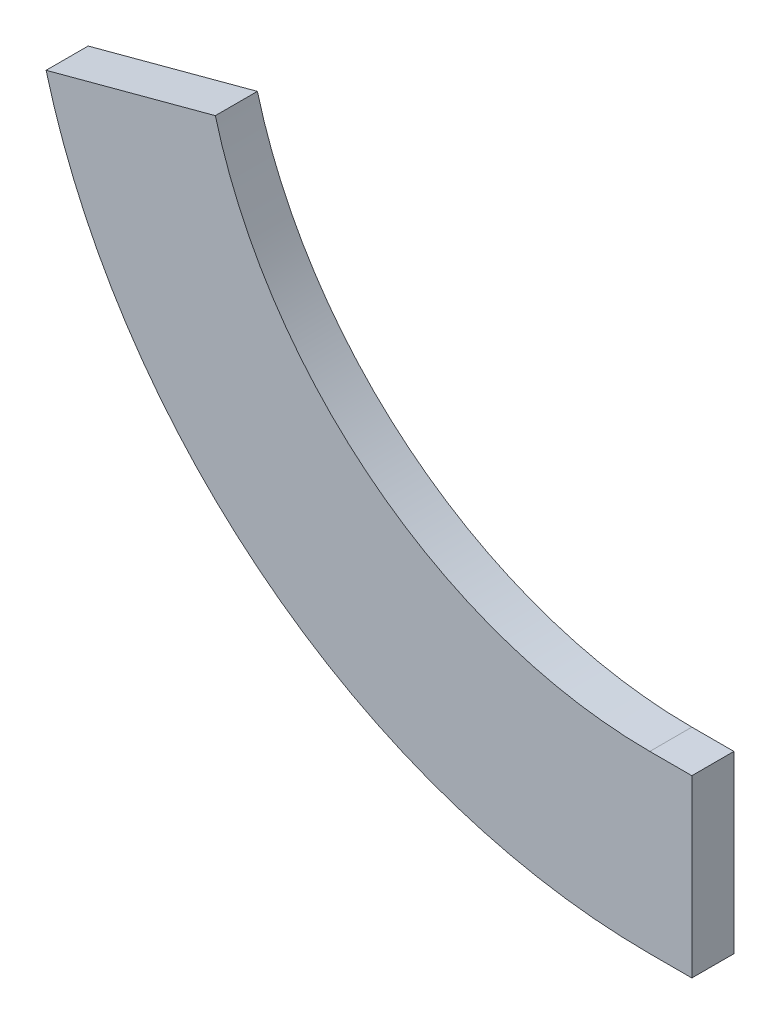
ISO-10303-21;
HEADER;
FILE_DESCRIPTION(('STEP AP214'),'2;1');
FILE_NAME('part.step','',(''),(''),'','','');
FILE_SCHEMA(('AUTOMOTIVE_DESIGN { 1 0 10303 214 1 1 1 1 }'));
ENDSEC;
DATA;
#1=APPLICATION_CONTEXT('core data for automotive mechanical design processes');
#2=APPLICATION_PROTOCOL_DEFINITION('international standard','automotive_design',2000,#1);
#3=PRODUCT_CONTEXT('',#1,'mechanical');
#4=PRODUCT('Part','Part','',(#3));
#5=PRODUCT_RELATED_PRODUCT_CATEGORY('part','',(#4));
#6=PRODUCT_DEFINITION_FORMATION('','',#4);
#7=PRODUCT_DEFINITION_CONTEXT('part definition',#1,'design');
#8=PRODUCT_DEFINITION('design','',#6,#7);
#9=PRODUCT_DEFINITION_SHAPE('','',#8);
#10=(LENGTH_UNIT() NAMED_UNIT(*) SI_UNIT(.MILLI.,.METRE.));
#11=(NAMED_UNIT(*) PLANE_ANGLE_UNIT() SI_UNIT($,.RADIAN.));
#12=(NAMED_UNIT(*) SI_UNIT($,.STERADIAN.) SOLID_ANGLE_UNIT());
#13=UNCERTAINTY_MEASURE_WITH_UNIT(LENGTH_MEASURE(1.E-05),#10,'distance_accuracy_value','');
#14=(GEOMETRIC_REPRESENTATION_CONTEXT(3) GLOBAL_UNCERTAINTY_ASSIGNED_CONTEXT((#13)) GLOBAL_UNIT_ASSIGNED_CONTEXT((#10,
#11,#12)) REPRESENTATION_CONTEXT('',''));
#15=CARTESIAN_POINT('',(0.,0.,0.));
#16=DIRECTION('',(0.,0.,1.));
#17=DIRECTION('',(1.,0.,0.));
#18=AXIS2_PLACEMENT_3D('',#15,#16,#17);
#19=CARTESIAN_POINT('',(-97.4016007566819,-31.75,1.524));
#20=DIRECTION('',(0.,-1.,0.));
#21=DIRECTION('',(1.,0.,0.));
#22=AXIS2_PLACEMENT_3D('',#19,#20,#21);
#23=PLANE('',#22);
#24=DIRECTION('',(-1.,0.,0.));
#25=VECTOR('',#24,1.);
#26=CARTESIAN_POINT('',(-97.4016007566819,-31.75,-1.524));
#27=LINE('',#26,#25);
#28=CARTESIAN_POINT('',(-97.4016007566819,-31.75,-1.524));
#29=VERTEX_POINT('',#28);
#30=CARTESIAN_POINT('',(-100.449600756682,-31.75,-1.524));
#31=VERTEX_POINT('',#30);
#32=EDGE_CURVE('E123',#29,#31,#27,.T.);
#33=ORIENTED_EDGE('',*,*,#32,.T.);
#34=DIRECTION('',(0.,0.,-1.));
#35=VECTOR('',#34,1.);
#36=CARTESIAN_POINT('',(-100.449600756682,-31.75,1.524));
#37=LINE('',#36,#35);
#38=CARTESIAN_POINT('',(-100.449600756682,-31.75,1.524));
#39=VERTEX_POINT('',#38);
#40=EDGE_CURVE('E11',#39,#31,#37,.T.);
#41=ORIENTED_EDGE('',*,*,#40,.F.);
#42=DIRECTION('',(-1.,0.,0.));
#43=VECTOR('',#42,1.);
#44=CARTESIAN_POINT('',(-97.4016007566819,-31.75,1.524));
#45=LINE('',#44,#43);
#46=CARTESIAN_POINT('',(-97.4016007566819,-31.75,1.524));
#47=VERTEX_POINT('',#46);
#48=EDGE_CURVE('E133',#47,#39,#45,.T.);
#49=ORIENTED_EDGE('',*,*,#48,.F.);
#50=DIRECTION('',(0.,0.,-1.));
#51=VECTOR('',#50,1.);
#52=CARTESIAN_POINT('',(-97.4016007566819,-31.75,1.524));
#53=LINE('',#52,#51);
#54=EDGE_CURVE('E119',#47,#29,#53,.T.);
#55=ORIENTED_EDGE('',*,*,#54,.T.);
#56=EDGE_LOOP('',(#33,#41,#49,#55));
#57=FACE_BOUND('',#56,.T.);
#58=ADVANCED_FACE('F39',(#57),#23,.F.);
#59=CARTESIAN_POINT('',(-100.449600756682,0.850738685968828,1.524));
#60=DIRECTION('',(0.,0.,-1.));
#61=DIRECTION('',(-1.,0.,0.));
#62=AXIS2_PLACEMENT_3D('',#59,#60,#61);
#63=CYLINDRICAL_SURFACE('',#62,32.6007386859688);
#64=CARTESIAN_POINT('',(-100.449600756682,0.850738685968828,-1.524));
#65=DIRECTION('',(0.,0.,-1.));
#66=DIRECTION('',(-1.,0.,0.));
#67=AXIS2_PLACEMENT_3D('',#64,#65,#66);
#68=CIRCLE('',#67,32.6007386859688);
#69=CARTESIAN_POINT('',(-131.93949620956,-7.58695337037059,-1.524));
#70=VERTEX_POINT('',#69);
#71=EDGE_CURVE('E126',#31,#70,#68,.T.);
#72=ORIENTED_EDGE('',*,*,#71,.T.);
#73=DIRECTION('',(0.,0.,-1.));
#74=VECTOR('',#73,1.);
#75=CARTESIAN_POINT('',(-131.93949620956,-7.58695337037059,1.524));
#76=LINE('',#75,#74);
#77=CARTESIAN_POINT('',(-131.93949620956,-7.58695337037059,1.524));
#78=VERTEX_POINT('',#77);
#79=EDGE_CURVE('E47',#78,#70,#76,.T.);
#80=ORIENTED_EDGE('',*,*,#79,.F.);
#81=CARTESIAN_POINT('',(-100.449600756682,0.850738685968828,1.524));
#82=DIRECTION('',(0.,0.,-1.));
#83=DIRECTION('',(-1.,0.,0.));
#84=AXIS2_PLACEMENT_3D('',#81,#82,#83);
#85=CIRCLE('',#84,32.6007386859688);
#86=EDGE_CURVE('E92',#39,#78,#85,.T.);
#87=ORIENTED_EDGE('',*,*,#86,.F.);
#88=ORIENTED_EDGE('',*,*,#40,.T.);
#89=EDGE_LOOP('',(#72,#80,#87,#88));
#90=FACE_BOUND('',#89,.T.);
#91=ADVANCED_FACE('F157',(#90),#63,.F.);
#92=CARTESIAN_POINT('',(-131.93949620956,-7.58695337037057,1.524));
#93=DIRECTION('',(0.258819045102524,-0.965925826289067,0.));
#94=DIRECTION('',(0.965925826289068,0.258819045102524,0.));
#95=AXIS2_PLACEMENT_3D('',#92,#93,#94);
#96=PLANE('',#95);
#97=DIRECTION('',(-0.965925826289067,-0.258819045102524,0.));
#98=VECTOR('',#97,1.);
#99=CARTESIAN_POINT('',(-131.93949620956,-7.58695337037057,-1.524));
#100=LINE('',#99,#98);
#101=CARTESIAN_POINT('',(-144.206754203431,-10.8739552431726,-1.524));
#102=VERTEX_POINT('',#101);
#103=EDGE_CURVE('E128',#70,#102,#100,.T.);
#104=ORIENTED_EDGE('',*,*,#103,.T.);
#105=DIRECTION('',(0.,0.,-1.));
#106=VECTOR('',#105,1.);
#107=CARTESIAN_POINT('',(-144.206754203431,-10.8739552431726,1.524));
#108=LINE('',#107,#106);
#109=CARTESIAN_POINT('',(-144.206754203431,-10.8739552431726,1.524));
#110=VERTEX_POINT('',#109);
#111=EDGE_CURVE('E114',#110,#102,#108,.T.);
#112=ORIENTED_EDGE('',*,*,#111,.F.);
#113=DIRECTION('',(-0.965925826289067,-0.258819045102524,0.));
#114=VECTOR('',#113,1.);
#115=CARTESIAN_POINT('',(-131.93949620956,-7.58695337037057,1.524));
#116=LINE('',#115,#114);
#117=EDGE_CURVE('E105',#78,#110,#116,.T.);
#118=ORIENTED_EDGE('',*,*,#117,.F.);
#119=ORIENTED_EDGE('',*,*,#79,.T.);
#120=EDGE_LOOP('',(#104,#112,#118,#119));
#121=FACE_BOUND('',#120,.T.);
#122=ADVANCED_FACE('F139',(#121),#96,.F.);
#123=CARTESIAN_POINT('',(-100.449600756682,0.850738685968806,1.524));
#124=DIRECTION('',(0.,0.,-1.));
#125=DIRECTION('',(-1.,0.,0.));
#126=AXIS2_PLACEMENT_3D('',#123,#124,#125);
#127=CYLINDRICAL_SURFACE('',#126,45.3007386859688);
#128=CARTESIAN_POINT('',(-100.449600756682,0.850738685968806,-1.524));
#129=DIRECTION('',(0.,0.,1.));
#130=DIRECTION('',(1.,0.,0.));
#131=AXIS2_PLACEMENT_3D('',#128,#129,#130);
#132=CIRCLE('',#131,45.3007386859688);
#133=CARTESIAN_POINT('',(-100.449600756682,-44.45,-1.524));
#134=VERTEX_POINT('',#133);
#135=EDGE_CURVE('E113',#102,#134,#132,.T.);
#136=ORIENTED_EDGE('',*,*,#135,.T.);
#137=DIRECTION('',(0.,0.,-1.));
#138=VECTOR('',#137,1.);
#139=CARTESIAN_POINT('',(-100.449600756682,-44.45,1.524));
#140=LINE('',#139,#138);
#141=CARTESIAN_POINT('',(-100.449600756682,-44.45,1.524));
#142=VERTEX_POINT('',#141);
#143=EDGE_CURVE('E110',#142,#134,#140,.T.);
#144=ORIENTED_EDGE('',*,*,#143,.F.);
#145=CARTESIAN_POINT('',(-100.449600756682,0.850738685968806,1.524));
#146=DIRECTION('',(0.,0.,1.));
#147=DIRECTION('',(1.,0.,0.));
#148=AXIS2_PLACEMENT_3D('',#145,#146,#147);
#149=CIRCLE('',#148,45.3007386859688);
#150=EDGE_CURVE('E99',#110,#142,#149,.T.);
#151=ORIENTED_EDGE('',*,*,#150,.F.);
#152=ORIENTED_EDGE('',*,*,#111,.T.);
#153=EDGE_LOOP('',(#136,#144,#151,#152));
#154=FACE_BOUND('',#153,.T.);
#155=ADVANCED_FACE('F111',(#154),#127,.T.);
#156=CARTESIAN_POINT('',(-100.449600756682,-44.45,1.524));
#157=DIRECTION('',(0.,1.,0.));
#158=DIRECTION('',(0.,0.,1.));
#159=AXIS2_PLACEMENT_3D('',#156,#157,#158);
#160=PLANE('',#159);
#161=DIRECTION('',(1.,0.,0.));
#162=VECTOR('',#161,1.);
#163=CARTESIAN_POINT('',(-100.449600756682,-44.45,-1.524));
#164=LINE('',#163,#162);
#165=CARTESIAN_POINT('',(-97.4016007566819,-44.45,-1.524));
#166=VERTEX_POINT('',#165);
#167=EDGE_CURVE('E78',#134,#166,#164,.T.);
#168=ORIENTED_EDGE('',*,*,#167,.T.);
#169=DIRECTION('',(0.,0.,-1.));
#170=VECTOR('',#169,1.);
#171=CARTESIAN_POINT('',(-97.4016007566819,-44.45,1.524));
#172=LINE('',#171,#170);
#173=CARTESIAN_POINT('',(-97.4016007566819,-44.45,1.524));
#174=VERTEX_POINT('',#173);
#175=EDGE_CURVE('E115',#174,#166,#172,.T.);
#176=ORIENTED_EDGE('',*,*,#175,.F.);
#177=DIRECTION('',(1.,0.,0.));
#178=VECTOR('',#177,1.);
#179=CARTESIAN_POINT('',(-100.449600756682,-44.45,1.524));
#180=LINE('',#179,#178);
#181=EDGE_CURVE('E103',#142,#174,#180,.T.);
#182=ORIENTED_EDGE('',*,*,#181,.F.);
#183=ORIENTED_EDGE('',*,*,#143,.T.);
#184=EDGE_LOOP('',(#168,#176,#182,#183));
#185=FACE_BOUND('',#184,.T.);
#186=ADVANCED_FACE('F117',(#185),#160,.F.);
#187=CARTESIAN_POINT('',(-97.4016007566819,-44.45,1.524));
#188=DIRECTION('',(-1.,0.,0.));
#189=DIRECTION('',(0.,0.,1.));
#190=AXIS2_PLACEMENT_3D('',#187,#188,#189);
#191=PLANE('',#190);
#192=DIRECTION('',(0.,1.,0.));
#193=VECTOR('',#192,1.);
#194=CARTESIAN_POINT('',(-97.4016007566819,-44.45,-1.524));
#195=LINE('',#194,#193);
#196=EDGE_CURVE('E84',#166,#29,#195,.T.);
#197=ORIENTED_EDGE('',*,*,#196,.T.);
#198=ORIENTED_EDGE('',*,*,#54,.F.);
#199=DIRECTION('',(0.,1.,0.));
#200=VECTOR('',#199,1.);
#201=CARTESIAN_POINT('',(-97.4016007566819,-44.45,1.524));
#202=LINE('',#201,#200);
#203=EDGE_CURVE('E55',#174,#47,#202,.T.);
#204=ORIENTED_EDGE('',*,*,#203,.F.);
#205=ORIENTED_EDGE('',*,*,#175,.T.);
#206=EDGE_LOOP('',(#197,#198,#204,#205));
#207=FACE_BOUND('',#206,.T.);
#208=ADVANCED_FACE('F146',(#207),#191,.F.);
#209=CARTESIAN_POINT('',(-100.449600756682,0.850738685968828,1.524));
#210=DIRECTION('',(0.,0.,-1.));
#211=DIRECTION('',(-1.,0.,0.));
#212=AXIS2_PLACEMENT_3D('',#209,#210,#211);
#213=PLANE('',#212);
#214=ORIENTED_EDGE('',*,*,#48,.T.);
#215=ORIENTED_EDGE('',*,*,#86,.T.);
#216=ORIENTED_EDGE('',*,*,#117,.T.);
#217=ORIENTED_EDGE('',*,*,#150,.T.);
#218=ORIENTED_EDGE('',*,*,#181,.T.);
#219=ORIENTED_EDGE('',*,*,#203,.T.);
#220=EDGE_LOOP('',(#214,#215,#216,#217,#218,#219));
#221=FACE_BOUND('',#220,.T.);
#222=ADVANCED_FACE('F101',(#221),#213,.F.);
#223=CARTESIAN_POINT('',(-100.449600756682,0.850738685968828,-1.524));
#224=DIRECTION('',(0.,0.,-1.));
#225=DIRECTION('',(-1.,0.,0.));
#226=AXIS2_PLACEMENT_3D('',#223,#224,#225);
#227=PLANE('',#226);
#228=ORIENTED_EDGE('',*,*,#32,.F.);
#229=ORIENTED_EDGE('',*,*,#196,.F.);
#230=ORIENTED_EDGE('',*,*,#167,.F.);
#231=ORIENTED_EDGE('',*,*,#135,.F.);
#232=ORIENTED_EDGE('',*,*,#103,.F.);
#233=ORIENTED_EDGE('',*,*,#71,.F.);
#234=EDGE_LOOP('',(#228,#229,#230,#231,#232,#233));
#235=FACE_BOUND('',#234,.T.);
#236=ADVANCED_FACE('F142',(#235),#227,.T.);
#237=CLOSED_SHELL('',(#58,#91,#122,#155,#186,#208,#222,#236));
#238=MANIFOLD_SOLID_BREP('B2',#237);
#239=ADVANCED_BREP_SHAPE_REPRESENTATION('',(#18,#238),#14);
#240=SHAPE_DEFINITION_REPRESENTATION(#9,#239);
ENDSEC;
END-ISO-10303-21;
